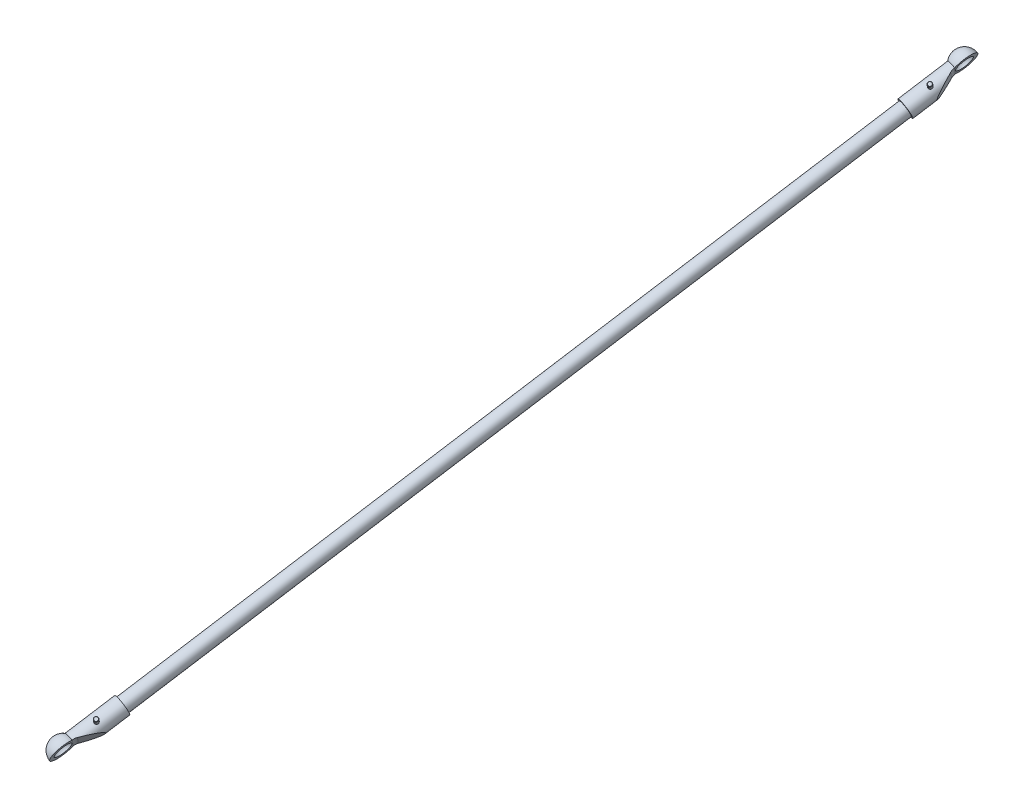
ISO-10303-21;
HEADER;
FILE_DESCRIPTION(('STEP AP214'),'2;1');
FILE_NAME('part.step','',(''),(''),'','','');
FILE_SCHEMA(('AUTOMOTIVE_DESIGN { 1 0 10303 214 1 1 1 1 }'));
ENDSEC;
DATA;
#1=APPLICATION_CONTEXT('core data for automotive mechanical design processes');
#2=APPLICATION_PROTOCOL_DEFINITION('international standard','automotive_design',2000,#1);
#3=PRODUCT_CONTEXT('',#1,'mechanical');
#4=PRODUCT('Part','Part','',(#3));
#5=PRODUCT_RELATED_PRODUCT_CATEGORY('part','',(#4));
#6=PRODUCT_DEFINITION_FORMATION('','',#4);
#7=PRODUCT_DEFINITION_CONTEXT('part definition',#1,'design');
#8=PRODUCT_DEFINITION('design','',#6,#7);
#9=PRODUCT_DEFINITION_SHAPE('','',#8);
#10=(LENGTH_UNIT() NAMED_UNIT(*) SI_UNIT(.MILLI.,.METRE.));
#11=(NAMED_UNIT(*) PLANE_ANGLE_UNIT() SI_UNIT($,.RADIAN.));
#12=(NAMED_UNIT(*) SI_UNIT($,.STERADIAN.) SOLID_ANGLE_UNIT());
#13=UNCERTAINTY_MEASURE_WITH_UNIT(LENGTH_MEASURE(1.E-05),#10,'distance_accuracy_value','');
#14=(GEOMETRIC_REPRESENTATION_CONTEXT(3) GLOBAL_UNCERTAINTY_ASSIGNED_CONTEXT((#13)) GLOBAL_UNIT_ASSIGNED_CONTEXT((#10,
#11,#12)) REPRESENTATION_CONTEXT('',''));
#15=CARTESIAN_POINT('',(0.,0.,0.));
#16=DIRECTION('',(0.,0.,1.));
#17=DIRECTION('',(1.,0.,0.));
#18=AXIS2_PLACEMENT_3D('',#15,#16,#17);
#19=CARTESIAN_POINT('',(-66.5672666528486,-13.4710930595909,-973.470594749536));
#20=DIRECTION('',(0.243875001140714,0.422187386320484,-0.873088079548963));
#21=DIRECTION('',(-0.436544042331025,-0.756116461061909,-0.487562505138062));
#22=AXIS2_PLACEMENT_3D('',#19,#20,#21);
#23=CYLINDRICAL_SURFACE('',#22,8.65);
#24=CARTESIAN_POINT('',(-79.3707042127361,-35.6359308414163,-927.633470573215));
#25=DIRECTION('',(0.243875001140714,0.422187386320484,-0.873088079548963));
#26=DIRECTION('',(-0.436544042331025,-0.756116461061909,-0.487562505138062));
#27=AXIS2_PLACEMENT_3D('',#24,#25,#26);
#28=CIRCLE('',#27,8.65);
#29=CARTESIAN_POINT('',(-83.1468101788995,-42.1763382296019,-931.850886242659));
#30=VERTEX_POINT('',#29);
#31=EDGE_CURVE('P0_E53',#30,#30,#28,.T.);
#32=ORIENTED_EDGE('',*,*,#31,.T.);
#33=EDGE_LOOP('',(#32));
#34=FACE_BOUND('',#33,.T.);
#35=DIRECTION('',(0.243875001140714,0.422187386320484,-0.873088079548963));
#36=VECTOR('',#35,1.);
#37=CARTESIAN_POINT('',(-70.343372619012,-20.0115004477764,-977.68801041898));
#38=LINE('',#37,#36);
#39=CARTESIAN_POINT('',(-72.4376135956511,-23.6369730059185,-970.190493970578));
#40=VERTEX_POINT('',#39);
#41=CARTESIAN_POINT('',(-72.3717544696229,-23.5229601216411,-970.426273847957));
#42=VERTEX_POINT('',#41);
#43=EDGE_CURVE('P0_E37',#40,#42,#38,.T.);
#44=ORIENTED_EDGE('',*,*,#43,.F.);
#45=CARTESIAN_POINT('',(-72.6861017253309,-25.6564240355279,-966.761144102993));
#46=CARTESIAN_POINT('',(-72.7043747173141,-25.5779330509969,-966.876927098913));
#47=CARTESIAN_POINT('',(-72.7196476328677,-25.4997304142377,-966.993353673411));
#48=CARTESIAN_POINT('',(-72.7442935848152,-25.3442520438576,-967.22744028067));
#49=CARTESIAN_POINT('',(-72.7536667541662,-25.2669762893869,-967.345100285574));
#50=CARTESIAN_POINT('',(-72.7730917032562,-25.0370163958307,-967.699924033564));
#51=CARTESIAN_POINT('',(-72.7744387973924,-24.8862439962847,-967.938866578895));
#52=CARTESIAN_POINT('',(-72.7548659493599,-24.5948501132937,-968.416482811695));
#53=CARTESIAN_POINT('',(-72.7343144313472,-24.4541018655955,-968.655095407673));
#54=CARTESIAN_POINT('',(-72.6722171491401,-24.1820303031464,-969.134789859197));
#55=CARTESIAN_POINT('',(-72.6306858069926,-24.0507005845941,-969.375869907166));
#56=CARTESIAN_POINT('',(-72.5586038599501,-23.8751848995356,-969.71272217079));
#57=CARTESIAN_POINT('',(-72.5366486889274,-23.8264150802868,-969.808025286144));
#58=CARTESIAN_POINT('',(-72.4895280297189,-23.7304513690291,-969.999045899332));
#59=CARTESIAN_POINT('',(-72.464352153529,-23.6832632291515,-970.094763724452));
#60=CARTESIAN_POINT('',(-72.4376135956511,-23.6369730059185,-970.190493970578));
#61=B_SPLINE_CURVE_WITH_KNOTS('',3,(#45,#46,#47,#48,#49,#50,#51,#52,#53,#54,#55,#56,#57,#58,#59,
#60),.UNSPECIFIED.,.F.,.F.,(4,2,2,2,2,2,2,4),(0.,0.423133087806681,0.846256639519751,
1.69274082725034,2.52520527690255,3.35709824718334,3.68490727157619,4.01380160023216),.UNSPECIFIED.);
#62=CARTESIAN_POINT('',(-72.6861017253309,-25.6564240355279,-966.761144102993));
#63=VERTEX_POINT('',#62);
#64=EDGE_CURVE('P0_E25',#63,#40,#61,.T.);
#65=ORIENTED_EDGE('',*,*,#64,.F.);
#66=CARTESIAN_POINT('',(-69.1576769270281,-17.9555155630788,-964.196760527297));
#67=DIRECTION('',(0.892445844922069,-0.295332745479864,-0.341055689482904));
#68=DIRECTION('',(-0.113884647721379,0.58400896119712,-0.80371874449638));
#69=AXIS2_PLACEMENT_3D('',#66,#67,#68);
#70=ELLIPSE('',#69,22.1379853543904,8.65);
#71=CARTESIAN_POINT('',(-65.1658502597658,-12.6309664114218,-958.362008418446));
#72=VERTEX_POINT('',#71);
#73=EDGE_CURVE('P0_E62',#72,#63,#70,.T.);
#74=ORIENTED_EDGE('',*,*,#73,.F.);
#75=CARTESIAN_POINT('',(-64.8854016633244,-10.5561582295475,-961.755662631689));
#76=CARTESIAN_POINT('',(-64.9198038793633,-10.6157146879746,-961.63250954567));
#77=CARTESIAN_POINT('',(-64.9516125956999,-10.6767480747575,-961.509366825998));
#78=CARTESIAN_POINT('',(-65.0100152347947,-10.801706563488,-961.263310287603));
#79=CARTESIAN_POINT('',(-65.0366090961444,-10.8656316994772,-961.140396471592));
#80=CARTESIAN_POINT('',(-65.108547350592,-11.0617086945621,-960.772203573503));
#81=CARTESIAN_POINT('',(-65.1460171195229,-11.1981079435305,-960.5275852597));
#82=CARTESIAN_POINT('',(-65.1995880235951,-11.4794440684664,-960.046525023254));
#83=CARTESIAN_POINT('',(-65.2160364409731,-11.6241997552243,-959.810014776676));
#84=CARTESIAN_POINT('',(-65.2291979072912,-11.9242315713149,-959.343376847598));
#85=CARTESIAN_POINT('',(-65.2259257251308,-12.0794997416238,-959.113244518361));
#86=CARTESIAN_POINT('',(-65.2082335240414,-12.3034781308216,-958.798642539105));
#87=CARTESIAN_POINT('',(-65.2017689958623,-12.3676342487357,-958.710398653834));
#88=CARTESIAN_POINT('',(-65.1859595293616,-12.4978827483923,-958.535153555313));
#89=CARTESIAN_POINT('',(-65.1766050318803,-12.5639808872438,-958.448157483915));
#90=CARTESIAN_POINT('',(-65.1658502597658,-12.6309664114219,-958.362008418446));
#91=B_SPLINE_CURVE_WITH_KNOTS('',3,(#75,#76,#77,#78,#79,#80,#81,#82,#83,#84,#85,#86,#87,#88,#89,
#90),.UNSPECIFIED.,.F.,.F.,(4,2,2,2,2,2,2,4),(0.,0.423104430557178,0.84621384317409,
1.69281689678866,2.5252448112881,3.35704939200978,3.68487734143038,4.0138014731745),.UNSPECIFIED.);
#92=CARTESIAN_POINT('',(-64.8854016633244,-10.5561582295475,-961.755662631689));
#93=VERTEX_POINT('',#92);
#94=EDGE_CURVE('P0_E11',#93,#72,#91,.T.);
#95=ORIENTED_EDGE('',*,*,#94,.F.);
#96=DIRECTION('',(0.243875001140714,0.422187386320484,-0.873088079548963));
#97=VECTOR('',#96,1.);
#98=CARTESIAN_POINT('',(-62.7911606866853,-6.93068567140542,-969.253179080091));
#99=LINE('',#98,#97);
#100=CARTESIAN_POINT('',(-64.8195425372962,-10.4421453452701,-961.991442509068));
#101=VERTEX_POINT('',#100);
#102=EDGE_CURVE('P0_E55',#101,#93,#99,.F.);
#103=ORIENTED_EDGE('',*,*,#102,.F.);
#104=CARTESIAN_POINT('',(-68.5956485034595,-16.9825527334556,-966.208858178512));
#105=DIRECTION('',(0.243875001140714,0.422187386320484,-0.873088079548963));
#106=DIRECTION('',(-0.436544042331025,-0.756116461061909,-0.487562505138062));
#107=AXIS2_PLACEMENT_3D('',#104,#105,#106);
#108=CIRCLE('',#107,8.65);
#109=EDGE_CURVE('P0_E49',#42,#101,#108,.T.);
#110=ORIENTED_EDGE('',*,*,#109,.F.);
#111=EDGE_LOOP('',(#44,#65,#74,#95,#103,#110));
#112=FACE_BOUND('',#111,.T.);
#113=ADVANCED_FACE('P0_F16',(#34,#112),#23,.T.);
#114=CARTESIAN_POINT('',(-66.5672666528486,-13.4710930595909,-973.470594749536));
#115=DIRECTION('',(0.243875001140714,0.422187386320484,-0.873088079548963));
#116=DIRECTION('',(-0.865999008616006,0.500045706054049,-9.45145584718802E-05));
#117=AXIS2_PLACEMENT_3D('',#114,#115,#116);
#118=SPHERICAL_SURFACE('',#117,12.);
#119=CARTESIAN_POINT('',(-66.5672666528486,-13.4710930595909,-973.470594749536));
#120=DIRECTION('',(0.865999008616006,-0.500045706054049,9.45145584718802E-05));
#121=DIRECTION('',(0.243875001140714,0.422187386320484,-0.873088079548963));
#122=AXIS2_PLACEMENT_3D('',#119,#120,#121);
#123=CIRCLE('',#122,12.);
#124=EDGE_CURVE('P0_E52',#42,#101,#123,.T.);
#125=ORIENTED_EDGE('',*,*,#124,.F.);
#126=ORIENTED_EDGE('',*,*,#109,.T.);
#127=EDGE_LOOP('',(#125,#126));
#128=FACE_BOUND('',#127,.T.);
#129=ADVANCED_FACE('P0_F50',(#128),#118,.T.);
#130=CARTESIAN_POINT('',(-79.3707042127361,-35.6359308414163,-927.633470573215));
#131=DIRECTION('',(0.243875001140714,0.422187386320484,-0.873088079548963));
#132=DIRECTION('',(-0.436544042331025,-0.756116461061909,-0.487562505138062));
#133=AXIS2_PLACEMENT_3D('',#130,#131,#132);
#134=PLANE('',#133);
#135=ORIENTED_EDGE('',*,*,#31,.F.);
#136=EDGE_LOOP('',(#135));
#137=FACE_BOUND('',#136,.T.);
#138=ADVANCED_FACE('P0_F18',(#137),#134,.F.);
#139=CARTESIAN_POINT('',(-15.5093941987425,54.9655954914829,-916.280260140939));
#140=DIRECTION('',(-0.436544042331025,-0.756116461061909,-0.487562505138062));
#141=DIRECTION('',(0.865999008616006,-0.500045706054049,9.45145584718802E-05));
#142=AXIS2_PLACEMENT_3D('',#139,#140,#141);
#143=CYLINDRICAL_SURFACE('',#142,10.);
#144=DIRECTION('',(-0.436544042331025,-0.756116461061909,-0.487562505138062));
#145=VECTOR('',#144,1.);
#146=CARTESIAN_POINT('',(-24.1693842849026,59.9660525520234,-916.281205286524));
#147=LINE('',#146,#145);
#148=EDGE_CURVE('P0_E59',#93,#40,#147,.T.);
#149=ORIENTED_EDGE('',*,*,#148,.F.);
#150=ORIENTED_EDGE('',*,*,#94,.T.);
#151=DIRECTION('',(-0.436544042331025,-0.756116461061909,-0.487562505138062));
#152=VECTOR('',#151,1.);
#153=CARTESIAN_POINT('',(-24.4338526479633,57.9189229462815,-912.86970324611));
#154=LINE('',#153,#152);
#155=EDGE_CURVE('P0_E154',#72,#63,#154,.T.);
#156=ORIENTED_EDGE('',*,*,#155,.T.);
#157=ORIENTED_EDGE('',*,*,#64,.T.);
#158=EDGE_LOOP('',(#149,#150,#156,#157));
#159=FACE_BOUND('',#158,.T.);
#160=ADVANCED_FACE('P0_F80',(#159),#143,.F.);
#161=CARTESIAN_POINT('',(-24.4338526479633,57.9189229462815,-912.86970324611));
#162=DIRECTION('',(0.892445844922069,-0.295332745479864,-0.341055689482904));
#163=DIRECTION('',(-0.113884647721379,0.58400896119712,-0.803718744496381));
#164=AXIS2_PLACEMENT_3D('',#161,#162,#163);
#165=PLANE('',#164);
#166=ORIENTED_EDGE('',*,*,#155,.F.);
#167=ORIENTED_EDGE('',*,*,#73,.T.);
#168=EDGE_LOOP('',(#166,#167));
#169=FACE_BOUND('',#168,.T.);
#170=ADVANCED_FACE('P0_F85',(#169),#165,.T.);
#171=CARTESIAN_POINT('',(-17.3493035482215,71.772724196292,-940.697529899156));
#172=DIRECTION('',(0.865999008616006,-0.500045706054049,9.45145584718802E-05));
#173=DIRECTION('',(0.243875001140714,0.422187386320484,-0.873088079548963));
#174=AXIS2_PLACEMENT_3D('',#171,#172,#173);
#175=PLANE('',#174);
#176=CARTESIAN_POINT('',(-66.5672666528486,-13.4710930595909,-973.470594749536));
#177=DIRECTION('',(0.865999008616006,-0.500045706054049,9.45145584718802E-05));
#178=DIRECTION('',(0.243875001140714,0.422187386320484,-0.873088079548963));
#179=AXIS2_PLACEMENT_3D('',#176,#177,#178);
#180=CIRCLE('',#179,7.97226838534743);
#181=CARTESIAN_POINT('',(-64.6230296912779,-10.1053019069357,-980.431087243748));
#182=VERTEX_POINT('',#181);
#183=EDGE_CURVE('P0_E20',#182,#182,#180,.T.);
#184=ORIENTED_EDGE('',*,*,#183,.F.);
#185=EDGE_LOOP('',(#184));
#186=FACE_BOUND('',#185,.T.);
#187=ORIENTED_EDGE('',*,*,#148,.T.);
#188=ORIENTED_EDGE('',*,*,#43,.T.);
#189=ORIENTED_EDGE('',*,*,#124,.T.);
#190=ORIENTED_EDGE('',*,*,#102,.T.);
#191=EDGE_LOOP('',(#187,#188,#189,#190));
#192=FACE_BOUND('',#191,.T.);
#193=ADVANCED_FACE('P0_F61',(#186,#192),#175,.T.);
#194=CARTESIAN_POINT('',(-66.5672666528486,-13.4710930595909,-973.470594749536));
#195=DIRECTION('',(-0.865999008616006,0.500045706054049,-9.45145584719848E-05));
#196=DIRECTION('',(-0.243875001140714,-0.422187386320483,0.873088079548963));
#197=AXIS2_PLACEMENT_3D('',#194,#195,#196);
#198=SPHERICAL_SURFACE('',#197,7.97226838534743);
#199=ORIENTED_EDGE('',*,*,#183,.T.);
#200=EDGE_LOOP('',(#199));
#201=FACE_BOUND('',#200,.T.);
#202=ADVANCED_FACE('P0_F90',(#201),#198,.F.);
#203=CLOSED_SHELL('',(#113,#129,#138,#160,#170,#193,#202));
#204=MANIFOLD_SOLID_BREP('P0_B1',#203);
#205=CARTESIAN_POINT('',(-66.4814626562708,-13.3163515001442,-940.971089621079));
#206=DIRECTION('',(0.436544042331025,0.75611646106191,0.487562505138062));
#207=DIRECTION('',(0.865999008616006,-0.500045706054049,9.45145584719375E-05));
#208=AXIS2_PLACEMENT_3D('',#205,#206,#207);
#209=PLANE('',#208);
#210=CARTESIAN_POINT('',(-66.8988120097736,-14.0388512722149,-939.476952280858));
#211=DIRECTION('',(-0.436544042331025,-0.75611646106191,-0.487562505138062));
#212=DIRECTION('',(-0.865999008616006,0.500045706054049,-9.45145584719375E-05));
#213=AXIS2_PLACEMENT_3D('',#210,#211,#212);
#214=CIRCLE('',#213,1.71132486540518);
#215=CARTESIAN_POINT('',(-68.3808176466344,-13.1831106216055,-939.477114025972));
#216=VERTEX_POINT('',#215);
#217=EDGE_CURVE('P1_E28',#216,#216,#214,.T.);
#218=ORIENTED_EDGE('',*,*,#217,.F.);
#219=EDGE_LOOP('',(#218));
#220=FACE_BOUND('',#219,.T.);
#221=ADVANCED_FACE('P1_F14',(#220),#209,.T.);
#222=CARTESIAN_POINT('',(-80.4508720108636,-37.5120782541253,-956.573089785497));
#223=DIRECTION('',(0.436544042331025,0.75611646106191,0.487562505138062));
#224=DIRECTION('',(0.865999008616006,-0.500045706054049,9.45145584719375E-05));
#225=AXIS2_PLACEMENT_3D('',#222,#223,#224);
#226=PLANE('',#225);
#227=CARTESIAN_POINT('',(-80.8682213643664,-38.234578026196,-955.078952445276));
#228=DIRECTION('',(-0.436544042331025,-0.75611646106191,-0.487562505138062));
#229=DIRECTION('',(-0.865999008616006,0.500045706054049,-9.45145584719375E-05));
#230=AXIS2_PLACEMENT_3D('',#227,#228,#229);
#231=CIRCLE('',#230,1.71132486540518);
#232=CARTESIAN_POINT('',(-82.3502270012272,-37.3788373755866,-955.07911419039));
#233=VERTEX_POINT('',#232);
#234=EDGE_CURVE('P1_E10',#233,#233,#231,.T.);
#235=ORIENTED_EDGE('',*,*,#234,.T.);
#236=EDGE_LOOP('',(#235));
#237=FACE_BOUND('',#236,.T.);
#238=ADVANCED_FACE('P1_F38',(#237),#226,.F.);
#239=CARTESIAN_POINT('',(-80.6499493432009,-37.8565197956651,-954.835171192707));
#240=DIRECTION('',(0.436544042331025,0.75611646106191,0.487562505138062));
#241=DIRECTION('',(0.865999008616006,-0.500045706054049,9.45145584719375E-05));
#242=AXIS2_PLACEMENT_3D('',#239,#240,#241);
#243=CONICAL_SURFACE('',#242,2.,0.523598775598299);
#244=ORIENTED_EDGE('',*,*,#234,.F.);
#245=EDGE_LOOP('',(#244));
#246=FACE_BOUND('',#245,.T.);
#247=CARTESIAN_POINT('',(-80.6499493432009,-37.8565197956651,-954.835171192707));
#248=DIRECTION('',(-0.436544042331025,-0.75611646106191,-0.487562505138062));
#249=DIRECTION('',(-0.865999008616006,0.500045706054049,-9.45145584719375E-05));
#250=AXIS2_PLACEMENT_3D('',#247,#248,#249);
#251=CIRCLE('',#250,2.);
#252=CARTESIAN_POINT('',(-82.3819473604329,-36.856428383557,-954.835360221824));
#253=VERTEX_POINT('',#252);
#254=EDGE_CURVE('P1_E20',#253,#253,#251,.T.);
#255=ORIENTED_EDGE('',*,*,#254,.T.);
#256=EDGE_LOOP('',(#255));
#257=FACE_BOUND('',#256,.T.);
#258=ADVANCED_FACE('P1_F43',(#246,#257),#243,.T.);
#259=CARTESIAN_POINT('',(-73.88351668707,-26.1367146492054,-947.277952363067));
#260=DIRECTION('',(-0.436544042331025,-0.75611646106191,-0.487562505138062));
#261=DIRECTION('',(-0.865999008616006,0.500045706054049,-9.45145584719375E-05));
#262=AXIS2_PLACEMENT_3D('',#259,#260,#261);
#263=CYLINDRICAL_SURFACE('',#262,2.);
#264=CARTESIAN_POINT('',(-67.1170840309392,-14.4169095027458,-939.720733533427));
#265=DIRECTION('',(-0.436544042331025,-0.75611646106191,-0.487562505138062));
#266=DIRECTION('',(-0.865999008616006,0.500045706054049,-9.45145584719375E-05));
#267=AXIS2_PLACEMENT_3D('',#264,#265,#266);
#268=CIRCLE('',#267,2.);
#269=CARTESIAN_POINT('',(-68.8490820481712,-13.4168180906377,-939.720922562544));
#270=VERTEX_POINT('',#269);
#271=EDGE_CURVE('P1_E24',#270,#270,#268,.T.);
#272=ORIENTED_EDGE('',*,*,#271,.T.);
#273=EDGE_LOOP('',(#272));
#274=FACE_BOUND('',#273,.T.);
#275=ORIENTED_EDGE('',*,*,#254,.F.);
#276=EDGE_LOOP('',(#275));
#277=FACE_BOUND('',#276,.T.);
#278=ADVANCED_FACE('P1_F47',(#274,#277),#263,.T.);
#279=CARTESIAN_POINT('',(-67.1170840309392,-14.4169095027458,-939.720733533427));
#280=DIRECTION('',(-0.436544042331025,-0.75611646106191,-0.487562505138062));
#281=DIRECTION('',(-0.865999008616006,0.500045706054049,-9.45145584719375E-05));
#282=AXIS2_PLACEMENT_3D('',#279,#280,#281);
#283=CONICAL_SURFACE('',#282,2.,0.523598775598299);
#284=ORIENTED_EDGE('',*,*,#217,.T.);
#285=EDGE_LOOP('',(#284));
#286=FACE_BOUND('',#285,.T.);
#287=ORIENTED_EDGE('',*,*,#271,.F.);
#288=EDGE_LOOP('',(#287));
#289=FACE_BOUND('',#288,.T.);
#290=ADVANCED_FACE('P1_F34',(#286,#289),#283,.T.);
#291=CLOSED_SHELL('',(#221,#238,#258,#278,#290));
#292=MANIFOLD_SOLID_BREP('P1_B1',#291);
#293=CARTESIAN_POINT('',(-261.667267565419,-351.221002115978,-275.000131110365));
#294=DIRECTION('',(-0.243875001140714,-0.422187386320483,0.873088079548963));
#295=DIRECTION('',(0.436544042331025,0.756116461061909,0.487562505138062));
#296=AXIS2_PLACEMENT_3D('',#293,#294,#295);
#297=CYLINDRICAL_SURFACE('',#296,8.65);
#298=CARTESIAN_POINT('',(-248.863830005532,-329.056164334152,-320.837255286686));
#299=DIRECTION('',(-0.243875001140714,-0.422187386320483,0.873088079548963));
#300=DIRECTION('',(0.436544042331025,0.756116461061909,0.487562505138062));
#301=AXIS2_PLACEMENT_3D('',#298,#299,#300);
#302=CIRCLE('',#301,8.65);
#303=CARTESIAN_POINT('',(-245.087724039369,-322.515756945967,-316.619839617242));
#304=VERTEX_POINT('',#303);
#305=EDGE_CURVE('P2_E53',#304,#304,#302,.T.);
#306=ORIENTED_EDGE('',*,*,#305,.T.);
#307=EDGE_LOOP('',(#306));
#308=FACE_BOUND('',#307,.T.);
#309=DIRECTION('',(-0.243875001140714,-0.422187386320483,0.873088079548963));
#310=VECTOR('',#309,1.);
#311=CARTESIAN_POINT('',(-257.891161599256,-344.680594727792,-270.782715440922));
#312=LINE('',#311,#310);
#313=CARTESIAN_POINT('',(-255.796920622617,-341.055122169651,-278.280231889323));
#314=VERTEX_POINT('',#313);
#315=CARTESIAN_POINT('',(-255.862779748645,-341.169135053928,-278.044452011944));
#316=VERTEX_POINT('',#315);
#317=EDGE_CURVE('P2_E37',#314,#316,#312,.T.);
#318=ORIENTED_EDGE('',*,*,#317,.F.);
#319=CARTESIAN_POINT('',(-254.171578130938,-339.830695273706,-281.709431487934));
#320=CARTESIAN_POINT('',(-254.248711238073,-339.854096806955,-281.593658904572));
#321=CARTESIAN_POINT('',(-254.324094954944,-339.879952432553,-281.477242224279));
#322=CARTESIAN_POINT('',(-254.471110419899,-339.936309956878,-281.243174352034));
#323=CARTESIAN_POINT('',(-254.542742252502,-339.966811750879,-281.125523187963));
#324=CARTESIAN_POINT('',(-254.751674279355,-340.064913612115,-280.770724362701));
#325=CARTESIAN_POINT('',(-254.882967502013,-340.139096754395,-280.531796293647));
#326=CARTESIAN_POINT('',(-255.125630934277,-340.301673528364,-280.054204408806));
#327=CARTESIAN_POINT('',(-255.237295100027,-340.389811452245,-279.815601756801));
#328=CARTESIAN_POINT('',(-255.44196590355,-340.579558120067,-279.335922865658));
#329=CARTESIAN_POINT('',(-255.534985296925,-340.681157574874,-279.09484843706));
#330=CARTESIAN_POINT('',(-255.651016360113,-340.831296132945,-278.758000970014));
#331=CARTESIAN_POINT('',(-255.682294858956,-340.87468247023,-278.662698872201));
#332=CARTESIAN_POINT('',(-255.741882183246,-340.963447671697,-278.471679619617));
#333=CARTESIAN_POINT('',(-255.770180833898,-341.00883265713,-278.375962135315));
#334=CARTESIAN_POINT('',(-255.796920622617,-341.055122169651,-278.280231889323));
#335=B_SPLINE_CURVE_WITH_KNOTS('',3,(#319,#320,#321,#322,#323,#324,#325,#326,#327,#328,#329,
#330,#331,#332,#333,#334),.UNSPECIFIED.,.F.,.F.,(4,2,2,2,2,2,2,4),(0.,0.423133087806677,
0.846256639519604,1.6927408272502,2.5252052769023,3.35709824718274,3.68490727157535,
4.01380160023115),.UNSPECIFIED.);
#336=CARTESIAN_POINT('',(-254.171578130938,-339.830695273706,-281.709431487934));
#337=VERTEX_POINT('',#336);
#338=EDGE_CURVE('P2_E25',#337,#314,#335,.T.);
#339=ORIENTED_EDGE('',*,*,#338,.F.);
#340=CARTESIAN_POINT('',(-259.07685729124,-346.73657961249,-284.273965332604));
#341=DIRECTION('',(0.701866736110001,-0.625256253261744,0.341229691702495));
#342=DIRECTION('',(-0.562860892092872,-0.193242115151691,0.8036448849362));
#343=AXIS2_PLACEMENT_3D('',#340,#341,#342);
#344=ELLIPSE('',#343,22.1379853543904,8.65);
#345=CARTESIAN_POINT('',(-261.691829596503,-352.856152897812,-290.108567172481));
#346=VERTEX_POINT('',#345);
#347=EDGE_CURVE('P2_E62',#346,#337,#344,.T.);
#348=ORIENTED_EDGE('',*,*,#347,.F.);
#349=CARTESIAN_POINT('',(-263.349132554944,-354.135936946021,-286.715063228212));
#350=CARTESIAN_POINT('',(-263.314729808775,-354.076380793702,-286.838216314173));
#351=CARTESIAN_POINT('',(-263.277751416177,-354.018332484721,-286.96135846963));
#352=CARTESIAN_POINT('',(-263.19868329709,-353.905306670775,-287.207412752608));
#353=CARTESIAN_POINT('',(-263.156593510421,-353.850329201977,-287.330324877404));
#354=CARTESIAN_POINT('',(-263.022677781853,-353.690039279969,-287.698511011313));
#355=CARTESIAN_POINT('',(-262.923236784394,-353.589423497744,-287.943122561617));
#356=CARTESIAN_POINT('',(-262.70627951249,-353.402430034692,-288.424164966183));
#357=CARTESIAN_POINT('',(-262.589093760245,-353.3158421648,-288.660664218355));
#358=CARTESIAN_POINT('',(-262.335745895177,-353.154498933977,-289.127275933649));
#359=CARTESIAN_POINT('',(-262.199598057829,-353.079734761247,-289.357393046677));
#360=CARTESIAN_POINT('',(-261.996719281165,-352.983118608274,-289.671970952963));
#361=CARTESIAN_POINT('',(-261.937908949428,-352.95665354207,-289.760207714178));
#362=CARTESIAN_POINT('',(-261.817171591838,-352.905249997641,-289.935437910069));
#363=CARTESIAN_POINT('',(-261.755234802016,-352.880316919881,-290.022426200783));
#364=CARTESIAN_POINT('',(-261.691829596503,-352.856152897812,-290.108567172481));
#365=B_SPLINE_CURVE_WITH_KNOTS('',3,(#349,#350,#351,#352,#353,#354,#355,#356,#357,#358,#359,
#360,#361,#362,#363,#364),.UNSPECIFIED.,.F.,.F.,(4,2,2,2,2,2,2,4),(0.,0.423104430557068,
0.846213843173972,1.69281689678892,2.52524481128839,3.35704939201012,3.68487734143041,
4.01380147317444),.UNSPECIFIED.);
#366=CARTESIAN_POINT('',(-263.349132554944,-354.135936946021,-286.715063228212));
#367=VERTEX_POINT('',#366);
#368=EDGE_CURVE('P2_E11',#367,#346,#365,.T.);
#369=ORIENTED_EDGE('',*,*,#368,.F.);
#370=DIRECTION('',(-0.243875001140714,-0.422187386320483,0.873088079548963));
#371=VECTOR('',#370,1.);
#372=CARTESIAN_POINT('',(-265.443373531583,-357.761409504163,-279.217546779809));
#373=LINE('',#372,#371);
#374=CARTESIAN_POINT('',(-263.414991680972,-354.249949830299,-286.479283350833));
#375=VERTEX_POINT('',#374);
#376=EDGE_CURVE('P2_E55',#375,#367,#373,.F.);
#377=ORIENTED_EDGE('',*,*,#376,.F.);
#378=CARTESIAN_POINT('',(-259.638885714809,-347.709542442114,-282.261867681388));
#379=DIRECTION('',(-0.243875001140714,-0.422187386320483,0.873088079548963));
#380=DIRECTION('',(0.436544042331025,0.756116461061909,0.487562505138062));
#381=AXIS2_PLACEMENT_3D('',#378,#379,#380);
#382=CIRCLE('',#381,8.65);
#383=EDGE_CURVE('P2_E49',#316,#375,#382,.T.);
#384=ORIENTED_EDGE('',*,*,#383,.F.);
#385=EDGE_LOOP('',(#318,#339,#348,#369,#377,#384));
#386=FACE_BOUND('',#385,.T.);
#387=ADVANCED_FACE('P2_F16',(#308,#386),#297,.T.);
#388=CARTESIAN_POINT('',(-261.667267565419,-351.221002115978,-275.000131110365));
#389=DIRECTION('',(-0.243875001140714,-0.422187386320483,0.873088079548963));
#390=DIRECTION('',(-0.865999008616006,0.500045706054049,-9.45145584719927E-05));
#391=AXIS2_PLACEMENT_3D('',#388,#389,#390);
#392=SPHERICAL_SURFACE('',#391,12.);
#393=CARTESIAN_POINT('',(-261.667267565419,-351.221002115978,-275.000131110365));
#394=DIRECTION('',(0.865999008616006,-0.500045706054049,9.45145584719927E-05));
#395=DIRECTION('',(-0.243875001140714,-0.422187386320483,0.873088079548963));
#396=AXIS2_PLACEMENT_3D('',#393,#394,#395);
#397=CIRCLE('',#396,12.);
#398=EDGE_CURVE('P2_E52',#316,#375,#397,.T.);
#399=ORIENTED_EDGE('',*,*,#398,.F.);
#400=ORIENTED_EDGE('',*,*,#383,.T.);
#401=EDGE_LOOP('',(#399,#400));
#402=FACE_BOUND('',#401,.T.);
#403=ADVANCED_FACE('P2_F50',(#402),#392,.T.);
#404=CARTESIAN_POINT('',(-248.863830005532,-329.056164334152,-320.837255286686));
#405=DIRECTION('',(-0.243875001140714,-0.422187386320483,0.873088079548963));
#406=DIRECTION('',(0.436544042331025,0.756116461061909,0.487562505138062));
#407=AXIS2_PLACEMENT_3D('',#404,#405,#406);
#408=PLANE('',#407);
#409=ORIENTED_EDGE('',*,*,#305,.F.);
#410=EDGE_LOOP('',(#409));
#411=FACE_BOUND('',#410,.T.);
#412=ADVANCED_FACE('P2_F18',(#411),#408,.F.);
#413=CARTESIAN_POINT('',(-295.405159847205,-429.658604788133,-332.188575427793));
#414=DIRECTION('',(0.436544042331025,0.756116461061909,0.487562505138062));
#415=DIRECTION('',(0.865999008616006,-0.500045706054049,9.45145584719927E-05));
#416=AXIS2_PLACEMENT_3D('',#413,#414,#415);
#417=CYLINDRICAL_SURFACE('',#416,10.);
#418=DIRECTION('',(0.436544042331025,0.756116461061909,0.487562505138062));
#419=VECTOR('',#418,1.);
#420=CARTESIAN_POINT('',(-304.065149933366,-424.658147727592,-332.189520573377));
#421=LINE('',#420,#419);
#422=EDGE_CURVE('P2_E59',#367,#314,#421,.T.);
#423=ORIENTED_EDGE('',*,*,#422,.F.);
#424=ORIENTED_EDGE('',*,*,#368,.T.);
#425=DIRECTION('',(0.436544042331025,0.756116461061909,0.487562505138062));
#426=VECTOR('',#425,1.);
#427=CARTESIAN_POINT('',(-302.423827208305,-423.406042255516,-335.600872344818));
#428=LINE('',#427,#426);
#429=EDGE_CURVE('P2_E154',#346,#337,#428,.T.);
#430=ORIENTED_EDGE('',*,*,#429,.T.);
#431=ORIENTED_EDGE('',*,*,#338,.T.);
#432=EDGE_LOOP('',(#423,#424,#430,#431));
#433=FACE_BOUND('',#432,.T.);
#434=ADVANCED_FACE('P2_F80',(#433),#417,.F.);
#435=CARTESIAN_POINT('',(-302.423827208305,-423.406042255516,-335.600872344818));
#436=DIRECTION('',(0.701866736110001,-0.625256253261744,0.341229691702495));
#437=DIRECTION('',(-0.562860892092872,-0.193242115151691,0.8036448849362));
#438=AXIS2_PLACEMENT_3D('',#435,#436,#437);
#439=PLANE('',#438);
#440=ORIENTED_EDGE('',*,*,#429,.F.);
#441=ORIENTED_EDGE('',*,*,#347,.T.);
#442=EDGE_LOOP('',(#440,#441));
#443=FACE_BOUND('',#442,.T.);
#444=ADVANCED_FACE('P2_F85',(#443),#439,.T.);
#445=CARTESIAN_POINT('',(-310.885230670047,-436.464819371861,-307.773195960745));
#446=DIRECTION('',(0.865999008616006,-0.500045706054049,9.45145584719927E-05));
#447=DIRECTION('',(-0.243875001140714,-0.422187386320483,0.873088079548963));
#448=AXIS2_PLACEMENT_3D('',#445,#446,#447);
#449=PLANE('',#448);
#450=CARTESIAN_POINT('',(-261.667267565419,-351.221002115978,-275.000131110365));
#451=DIRECTION('',(0.865999008616006,-0.500045706054049,9.45145584719927E-05));
#452=DIRECTION('',(-0.243875001140714,-0.422187386320483,0.873088079548963));
#453=AXIS2_PLACEMENT_3D('',#450,#451,#452);
#454=CIRCLE('',#453,7.97226838534743);
#455=CARTESIAN_POINT('',(-263.61150452699,-354.586793268633,-268.039638616154));
#456=VERTEX_POINT('',#455);
#457=EDGE_CURVE('P2_E20',#456,#456,#454,.T.);
#458=ORIENTED_EDGE('',*,*,#457,.F.);
#459=EDGE_LOOP('',(#458));
#460=FACE_BOUND('',#459,.T.);
#461=ORIENTED_EDGE('',*,*,#422,.T.);
#462=ORIENTED_EDGE('',*,*,#317,.T.);
#463=ORIENTED_EDGE('',*,*,#398,.T.);
#464=ORIENTED_EDGE('',*,*,#376,.T.);
#465=EDGE_LOOP('',(#461,#462,#463,#464));
#466=FACE_BOUND('',#465,.T.);
#467=ADVANCED_FACE('P2_F61',(#460,#466),#449,.T.);
#468=CARTESIAN_POINT('',(-261.667267565419,-351.221002115978,-275.000131110365));
#469=DIRECTION('',(-0.865999008616006,0.500045706054049,-9.45145584718882E-05));
#470=DIRECTION('',(0.243875001140714,0.422187386320483,-0.873088079548963));
#471=AXIS2_PLACEMENT_3D('',#468,#469,#470);
#472=SPHERICAL_SURFACE('',#471,7.97226838534743);
#473=ORIENTED_EDGE('',*,*,#457,.T.);
#474=EDGE_LOOP('',(#473));
#475=FACE_BOUND('',#474,.T.);
#476=ADVANCED_FACE('P2_F90',(#475),#472,.F.);
#477=CLOSED_SHELL('',(#387,#403,#412,#434,#444,#467,#476));
#478=MANIFOLD_SOLID_BREP('P2_B1',#477);
#479=CARTESIAN_POINT('',(-261.753071561998,-351.375743675425,-307.499636238823));
#480=DIRECTION('',(-0.436544042331025,-0.756116461061909,-0.487562505138062));
#481=DIRECTION('',(0.865999008616006,-0.500045706054049,9.45145584719355E-05));
#482=AXIS2_PLACEMENT_3D('',#479,#480,#481);
#483=PLANE('',#482);
#484=CARTESIAN_POINT('',(-261.335722208494,-350.653243903354,-308.993773579044));
#485=DIRECTION('',(0.436544042331025,0.756116461061909,0.487562505138062));
#486=DIRECTION('',(-0.865999008616006,0.500045706054049,-9.45145584719355E-05));
#487=AXIS2_PLACEMENT_3D('',#484,#485,#486);
#488=CIRCLE('',#487,1.71132486540518);
#489=CARTESIAN_POINT('',(-262.817727845355,-349.797503252745,-308.993935324158));
#490=VERTEX_POINT('',#489);
#491=EDGE_CURVE('P3_E28',#490,#490,#488,.T.);
#492=ORIENTED_EDGE('',*,*,#491,.F.);
#493=EDGE_LOOP('',(#492));
#494=FACE_BOUND('',#493,.T.);
#495=ADVANCED_FACE('P3_F14',(#494),#483,.T.);
#496=CARTESIAN_POINT('',(-247.783662207404,-327.180016921443,-291.897636074404));
#497=DIRECTION('',(-0.436544042331025,-0.756116461061909,-0.487562505138062));
#498=DIRECTION('',(0.865999008616006,-0.500045706054049,9.45145584719355E-05));
#499=AXIS2_PLACEMENT_3D('',#496,#497,#498);
#500=PLANE('',#499);
#501=CARTESIAN_POINT('',(-247.366312853902,-326.457517149373,-293.391773414626));
#502=DIRECTION('',(0.436544042331025,0.756116461061909,0.487562505138062));
#503=DIRECTION('',(-0.865999008616006,0.500045706054049,-9.45145584719355E-05));
#504=AXIS2_PLACEMENT_3D('',#501,#502,#503);
#505=CIRCLE('',#504,1.71132486540518);
#506=CARTESIAN_POINT('',(-245.884307217041,-327.313257799982,-293.391611669511));
#507=VERTEX_POINT('',#506);
#508=EDGE_CURVE('P3_E10',#507,#507,#505,.T.);
#509=ORIENTED_EDGE('',*,*,#508,.T.);
#510=EDGE_LOOP('',(#509));
#511=FACE_BOUND('',#510,.T.);
#512=ADVANCED_FACE('P3_F38',(#511),#500,.F.);
#513=CARTESIAN_POINT('',(-247.584584875067,-326.835575379904,-293.635554667195));
#514=DIRECTION('',(-0.436544042331025,-0.756116461061909,-0.487562505138062));
#515=DIRECTION('',(0.865999008616006,-0.500045706054049,9.45145584719355E-05));
#516=AXIS2_PLACEMENT_3D('',#513,#514,#515);
#517=CONICAL_SURFACE('',#516,2.,0.523598775598299);
#518=CARTESIAN_POINT('',(-247.584584875067,-326.835575379904,-293.635554667195));
#519=DIRECTION('',(0.436544042331025,0.756116461061909,0.487562505138062));
#520=DIRECTION('',(-0.865999008616006,0.500045706054049,-9.45145584719355E-05));
#521=AXIS2_PLACEMENT_3D('',#518,#519,#520);
#522=CIRCLE('',#521,2.);
#523=CARTESIAN_POINT('',(-245.852586857835,-327.835666792012,-293.635365638078));
#524=VERTEX_POINT('',#523);
#525=EDGE_CURVE('P3_E20',#524,#524,#522,.T.);
#526=CARTESIAN_POINT('',(-245.884307217041,-327.313257799982,-293.391611669511));
#527=CARTESIAN_POINT('',(-245.883976796633,-327.318699560316,-293.394150773351));
#528=CARTESIAN_POINT('',(-245.883646376224,-327.32414132065,-293.39668987719));
#529=CARTESIAN_POINT('',(-245.882985535408,-327.335024841317,-293.401768084868));
#530=CARTESIAN_POINT('',(-245.882655114999,-327.340466601651,-293.404307188708));
#531=CARTESIAN_POINT('',(-245.881994274182,-327.351350122318,-293.409385396386));
#532=CARTESIAN_POINT('',(-245.881663853774,-327.356791882652,-293.411924500225));
#533=CARTESIAN_POINT('',(-245.881003012957,-327.367675403319,-293.417002707904));
#534=CARTESIAN_POINT('',(-245.880672592549,-327.373117163652,-293.419541811743));
#535=CARTESIAN_POINT('',(-245.880011751732,-327.38400068432,-293.424620019421));
#536=CARTESIAN_POINT('',(-245.879681331324,-327.389442444653,-293.427159123261));
#537=CARTESIAN_POINT('',(-245.879020490507,-327.400325965321,-293.432237330939));
#538=CARTESIAN_POINT('',(-245.878690070098,-327.405767725654,-293.434776434778));
#539=CARTESIAN_POINT('',(-245.878029229282,-327.416651246322,-293.439854642457));
#540=CARTESIAN_POINT('',(-245.877698808873,-327.422093006655,-293.442393746296));
#541=CARTESIAN_POINT('',(-245.877037968057,-327.432976527323,-293.447471953975));
#542=CARTESIAN_POINT('',(-245.876707547648,-327.438418287656,-293.450011057814));
#543=CARTESIAN_POINT('',(-245.876046706831,-327.449301808323,-293.455089265492));
#544=CARTESIAN_POINT('',(-245.875716286423,-327.454743568657,-293.457628369331));
#545=CARTESIAN_POINT('',(-245.875055445606,-327.465627089324,-293.46270657701));
#546=CARTESIAN_POINT('',(-245.874725025198,-327.471068849658,-293.465245680849));
#547=CARTESIAN_POINT('',(-245.874064184381,-327.481952370325,-293.470323888528));
#548=CARTESIAN_POINT('',(-245.873733763973,-327.487394130659,-293.472862992367));
#549=CARTESIAN_POINT('',(-245.873072923156,-327.498277651326,-293.477941200045));
#550=CARTESIAN_POINT('',(-245.872742502747,-327.50371941166,-293.480480303885));
#551=CARTESIAN_POINT('',(-245.872081661931,-327.514602932327,-293.485558511563));
#552=CARTESIAN_POINT('',(-245.871751241522,-327.520044692661,-293.488097615402));
#553=CARTESIAN_POINT('',(-245.871090400705,-327.530928213328,-293.493175823081));
#554=CARTESIAN_POINT('',(-245.870759980297,-327.536369973662,-293.49571492692));
#555=CARTESIAN_POINT('',(-245.87009913948,-327.547253494329,-293.500793134598));
#556=CARTESIAN_POINT('',(-245.869768719072,-327.552695254663,-293.503332238438));
#557=CARTESIAN_POINT('',(-245.869107878255,-327.56357877533,-293.508410446116));
#558=CARTESIAN_POINT('',(-245.868777457847,-327.569020535664,-293.510949549955));
#559=CARTESIAN_POINT('',(-245.86811661703,-327.579904056331,-293.516027757634));
#560=CARTESIAN_POINT('',(-245.867786196622,-327.585345816665,-293.518566861473));
#561=CARTESIAN_POINT('',(-245.867125355805,-327.596229337332,-293.523645069151));
#562=CARTESIAN_POINT('',(-245.866794935396,-327.601671097665,-293.526184172991));
#563=CARTESIAN_POINT('',(-245.86613409458,-327.612554618333,-293.531262380669));
#564=CARTESIAN_POINT('',(-245.865803674171,-327.617996378666,-293.533801484508));
#565=CARTESIAN_POINT('',(-245.865142833354,-327.628879899334,-293.538879692187));
#566=CARTESIAN_POINT('',(-245.864812412946,-327.634321659667,-293.541418796026));
#567=CARTESIAN_POINT('',(-245.864151572129,-327.645205180335,-293.546497003704));
#568=CARTESIAN_POINT('',(-245.863821151721,-327.650646940668,-293.549036107544));
#569=CARTESIAN_POINT('',(-245.863160310904,-327.661530461336,-293.554114315222));
#570=CARTESIAN_POINT('',(-245.862829890496,-327.666972221669,-293.556653419061));
#571=CARTESIAN_POINT('',(-245.862169049679,-327.677855742336,-293.56173162674));
#572=CARTESIAN_POINT('',(-245.86183862927,-327.68329750267,-293.564270730579));
#573=CARTESIAN_POINT('',(-245.861177788454,-327.694181023337,-293.569348938258));
#574=CARTESIAN_POINT('',(-245.860847368045,-327.699622783671,-293.571888042097));
#575=CARTESIAN_POINT('',(-245.860186527229,-327.710506304338,-293.576966249775));
#576=CARTESIAN_POINT('',(-245.85985610682,-327.715948064672,-293.579505353615));
#577=CARTESIAN_POINT('',(-245.859195266003,-327.726831585339,-293.584583561293));
#578=CARTESIAN_POINT('',(-245.858864845595,-327.732273345673,-293.587122665132));
#579=CARTESIAN_POINT('',(-245.858204004778,-327.74315686634,-293.592200872811));
#580=CARTESIAN_POINT('',(-245.85787358437,-327.748598626674,-293.59473997665));
#581=CARTESIAN_POINT('',(-245.857212743553,-327.759482147341,-293.599818184328));
#582=CARTESIAN_POINT('',(-245.856882323145,-327.764923907675,-293.602357288168));
#583=CARTESIAN_POINT('',(-245.856221482328,-327.775807428342,-293.607435495846));
#584=CARTESIAN_POINT('',(-245.855891061919,-327.781249188676,-293.609974599685));
#585=CARTESIAN_POINT('',(-245.855230221103,-327.792132709343,-293.615052807364));
#586=CARTESIAN_POINT('',(-245.854899800694,-327.797574469677,-293.617591911203));
#587=CARTESIAN_POINT('',(-245.854238959877,-327.808457990344,-293.622670118882));
#588=CARTESIAN_POINT('',(-245.853908539469,-327.813899750678,-293.625209222721));
#589=CARTESIAN_POINT('',(-245.853247698652,-327.824783271345,-293.630287430399));
#590=CARTESIAN_POINT('',(-245.852917278244,-327.830225031678,-293.632826534238));
#591=CARTESIAN_POINT('',(-245.852586857835,-327.835666792012,-293.635365638078));
#592=B_SPLINE_CURVE_WITH_KNOTS('',3,(#526,#527,#528,#529,#530,#531,#532,#533,#534,#535,#536,
#537,#538,#539,#540,#541,#542,#543,#544,#545,#546,#547,#548,#549,#550,#551,#552,#553,#554,#555,
#556,#557,#558,#559,#560,#561,#562,#563,#564,#565,#566,#567,#568,#569,#570,#571,#572,#573,#574,
#575,#576,#577,#578,#579,#580,#581,#582,#583,#584,#585,#586,#587,#588,#589,#590,#591),
.UNSPECIFIED.,.F.,.F.,(4,2,2,2,2,2,2,2,2,2,2,2,2,2,2,2,2,2,2,2,2,2,2,2,2,2,2,2,2,2,2,2,4),(0.,
0.0180421959121642,0.0360843918243502,0.0541265877365378,0.0721687836487254,0.0902109795608881,
0.108253175473076,0.12629537138524,0.144337567297427,0.16237976320959,0.180421959121778,
0.198464155033965,0.216506350946151,0.234548546858292,0.25259074277048,0.270632938682666,
0.28867513459483,0.306717330507018,0.324759526419204,0.34280172233142,0.360843918243582,
0.378886114155768,0.396928310067957,0.414970505980143,0.433012701892306,0.451054897804495,
0.469097093716658,0.487139289628845,0.50518148554101,0.523223681453196,0.541265877365383,
0.559308073277571,0.57735026918971),.UNSPECIFIED.);
#593=EDGE_CURVE('P3_BSEAM43',#507,#524,#592,.T.);
#594=ORIENTED_EDGE('',*,*,#508,.F.);
#595=ORIENTED_EDGE('',*,*,#525,.T.);
#596=ORIENTED_EDGE('',*,*,#593,.T.);
#597=ORIENTED_EDGE('',*,*,#593,.F.);
#598=EDGE_LOOP('',(#594,#596,#595,#597));
#599=FACE_BOUND('',#598,.T.);
#600=ADVANCED_FACE('P3_F43',(#599),#517,.T.);
#601=CARTESIAN_POINT('',(-254.351017531198,-338.555380526364,-301.192773496835));
#602=DIRECTION('',(0.436544042331025,0.756116461061909,0.487562505138062));
#603=DIRECTION('',(-0.865999008616006,0.500045706054049,-9.45145584719355E-05));
#604=AXIS2_PLACEMENT_3D('',#601,#602,#603);
#605=CYLINDRICAL_SURFACE('',#604,2.);
#606=CARTESIAN_POINT('',(-261.117450187329,-350.275185672823,-308.749992326475));
#607=DIRECTION('',(0.436544042331025,0.756116461061909,0.487562505138062));
#608=DIRECTION('',(-0.865999008616006,0.500045706054049,-9.45145584719355E-05));
#609=AXIS2_PLACEMENT_3D('',#606,#607,#608);
#610=CIRCLE('',#609,2.);
#611=CARTESIAN_POINT('',(-262.849448204561,-349.275094260715,-308.750181355591));
#612=VERTEX_POINT('',#611);
#613=EDGE_CURVE('P3_E24',#612,#612,#610,.T.);
#614=ORIENTED_EDGE('',*,*,#613,.T.);
#615=EDGE_LOOP('',(#614));
#616=FACE_BOUND('',#615,.T.);
#617=ORIENTED_EDGE('',*,*,#525,.F.);
#618=EDGE_LOOP('',(#617));
#619=FACE_BOUND('',#618,.T.);
#620=ADVANCED_FACE('P3_F47',(#616,#619),#605,.T.);
#621=CARTESIAN_POINT('',(-261.117450187329,-350.275185672823,-308.749992326475));
#622=DIRECTION('',(0.436544042331025,0.756116461061909,0.487562505138062));
#623=DIRECTION('',(-0.865999008616006,0.500045706054049,-9.45145584719355E-05));
#624=AXIS2_PLACEMENT_3D('',#621,#622,#623);
#625=CONICAL_SURFACE('',#624,2.,0.523598775598299);
#626=CARTESIAN_POINT('',(-262.817727845355,-349.797503252745,-308.993935324158));
#627=CARTESIAN_POINT('',(-262.818058265764,-349.792061492411,-308.991396220318));
#628=CARTESIAN_POINT('',(-262.818388686172,-349.786619732077,-308.988857116479));
#629=CARTESIAN_POINT('',(-262.819049526989,-349.77573621141,-308.983778908801));
#630=CARTESIAN_POINT('',(-262.819379947397,-349.770294451076,-308.981239804961));
#631=CARTESIAN_POINT('',(-262.820040788214,-349.759410930409,-308.976161597283));
#632=CARTESIAN_POINT('',(-262.820371208622,-349.753969170075,-308.973622493444));
#633=CARTESIAN_POINT('',(-262.821032049439,-349.743085649408,-308.968544285765));
#634=CARTESIAN_POINT('',(-262.821362469848,-349.737643889075,-308.966005181926));
#635=CARTESIAN_POINT('',(-262.822023310664,-349.726760368407,-308.960926974248));
#636=CARTESIAN_POINT('',(-262.822353731073,-349.721318608074,-308.958387870408));
#637=CARTESIAN_POINT('',(-262.82301457189,-349.710435087406,-308.95330966273));
#638=CARTESIAN_POINT('',(-262.823344992298,-349.704993327073,-308.950770558891));
#639=CARTESIAN_POINT('',(-262.824005833115,-349.694109806405,-308.945692351212));
#640=CARTESIAN_POINT('',(-262.824336253523,-349.688668046072,-308.943153247373));
#641=CARTESIAN_POINT('',(-262.82499709434,-349.677784525404,-308.938075039695));
#642=CARTESIAN_POINT('',(-262.825327514748,-349.672342765071,-308.935535935855));
#643=CARTESIAN_POINT('',(-262.825988355565,-349.661459244404,-308.930457728177));
#644=CARTESIAN_POINT('',(-262.826318775973,-349.65601748407,-308.927918624338));
#645=CARTESIAN_POINT('',(-262.82697961679,-349.645133963403,-308.922840416659));
#646=CARTESIAN_POINT('',(-262.827310037199,-349.639692203069,-308.92030131282));
#647=CARTESIAN_POINT('',(-262.827970878015,-349.628808682402,-308.915223105141));
#648=CARTESIAN_POINT('',(-262.828301298424,-349.623366922068,-308.912684001302));
#649=CARTESIAN_POINT('',(-262.828962139241,-349.612483401401,-308.907605793624));
#650=CARTESIAN_POINT('',(-262.829292559649,-349.607041641067,-308.905066689784));
#651=CARTESIAN_POINT('',(-262.829953400466,-349.5961581204,-308.899988482106));
#652=CARTESIAN_POINT('',(-262.830283820874,-349.590716360066,-308.897449378267));
#653=CARTESIAN_POINT('',(-262.830944661691,-349.579832839399,-308.892371170588));
#654=CARTESIAN_POINT('',(-262.831275082099,-349.574391079065,-308.889832066749));
#655=CARTESIAN_POINT('',(-262.831935922916,-349.563507558398,-308.884753859071));
#656=CARTESIAN_POINT('',(-262.832266343325,-349.558065798064,-308.882214755231));
#657=CARTESIAN_POINT('',(-262.832927184141,-349.547182277397,-308.877136547553));
#658=CARTESIAN_POINT('',(-262.83325760455,-349.541740517063,-308.874597443714));
#659=CARTESIAN_POINT('',(-262.833918445367,-349.530856996396,-308.869519236035));
#660=CARTESIAN_POINT('',(-262.834248865775,-349.525415236062,-308.866980132196));
#661=CARTESIAN_POINT('',(-262.834909706592,-349.514531715395,-308.861901924518));
#662=CARTESIAN_POINT('',(-262.835240127,-349.509089955062,-308.859362820678));
#663=CARTESIAN_POINT('',(-262.835900967817,-349.498206434394,-308.854284613));
#664=CARTESIAN_POINT('',(-262.836231388225,-349.492764674061,-308.851745509161));
#665=CARTESIAN_POINT('',(-262.836892229042,-349.481881153393,-308.846667301482));
#666=CARTESIAN_POINT('',(-262.83722264945,-349.47643939306,-308.844128197643));
#667=CARTESIAN_POINT('',(-262.837883490267,-349.465555872392,-308.839049989965));
#668=CARTESIAN_POINT('',(-262.838213910676,-349.460114112059,-308.836510886125));
#669=CARTESIAN_POINT('',(-262.838874751492,-349.449230591391,-308.831432678447));
#670=CARTESIAN_POINT('',(-262.839205171901,-349.443788831058,-308.828893574608));
#671=CARTESIAN_POINT('',(-262.839866012718,-349.43290531039,-308.823815366929));
#672=CARTESIAN_POINT('',(-262.840196433126,-349.427463550057,-308.82127626309));
#673=CARTESIAN_POINT('',(-262.840857273943,-349.41658002939,-308.816198055411));
#674=CARTESIAN_POINT('',(-262.841187694351,-349.411138269056,-308.813658951572));
#675=CARTESIAN_POINT('',(-262.841848535168,-349.400254748389,-308.808580743894));
#676=CARTESIAN_POINT('',(-262.842178955576,-349.394812988055,-308.806041640055));
#677=CARTESIAN_POINT('',(-262.842839796393,-349.383929467388,-308.800963432376));
#678=CARTESIAN_POINT('',(-262.843170216802,-349.378487707054,-308.798424328537));
#679=CARTESIAN_POINT('',(-262.843831057618,-349.367604186387,-308.793346120858));
#680=CARTESIAN_POINT('',(-262.844161478027,-349.362162426053,-308.790807017019));
#681=CARTESIAN_POINT('',(-262.844822318844,-349.351278905386,-308.785728809341));
#682=CARTESIAN_POINT('',(-262.845152739252,-349.345837145052,-308.783189705501));
#683=CARTESIAN_POINT('',(-262.845813580069,-349.334953624385,-308.778111497823));
#684=CARTESIAN_POINT('',(-262.846144000477,-349.329511864051,-308.775572393984));
#685=CARTESIAN_POINT('',(-262.846804841294,-349.318628343384,-308.770494186305));
#686=CARTESIAN_POINT('',(-262.847135261702,-349.31318658305,-308.767955082466));
#687=CARTESIAN_POINT('',(-262.847796102519,-349.302303062383,-308.762876874788));
#688=CARTESIAN_POINT('',(-262.848126522927,-349.296861302049,-308.760337770948));
#689=CARTESIAN_POINT('',(-262.848787363744,-349.285977781382,-308.75525956327));
#690=CARTESIAN_POINT('',(-262.849117784153,-349.280536021049,-308.752720459431));
#691=CARTESIAN_POINT('',(-262.849448204561,-349.275094260715,-308.750181355591));
#692=B_SPLINE_CURVE_WITH_KNOTS('',3,(#626,#627,#628,#629,#630,#631,#632,#633,#634,#635,#636,
#637,#638,#639,#640,#641,#642,#643,#644,#645,#646,#647,#648,#649,#650,#651,#652,#653,#654,#655,
#656,#657,#658,#659,#660,#661,#662,#663,#664,#665,#666,#667,#668,#669,#670,#671,#672,#673,#674,
#675,#676,#677,#678,#679,#680,#681,#682,#683,#684,#685,#686,#687,#688,#689,#690,#691),
.UNSPECIFIED.,.F.,.F.,(4,2,2,2,2,2,2,2,2,2,2,2,2,2,2,2,2,2,2,2,2,2,2,2,2,2,2,2,2,2,2,2,4),(0.,
0.0180421959121626,0.0360843918243487,0.0541265877365379,0.072168783648727,0.0902109795608866,
0.108253175473076,0.126295371385241,0.144337567297424,0.16237976320959,0.180421959121779,
0.198464155033962,0.216506350946151,0.234548546858294,0.252590742770477,0.270632938682666,
0.288675134594832,0.306717330507014,0.324759526419204,0.34280172233142,0.360843918243579,
0.378886114155768,0.396928310067957,0.414970505980144,0.433012701892306,0.451054897804495,
0.469097093716658,0.487139289628844,0.50518148554101,0.523223681453196,0.541265877365382,
0.559308073277571,0.57735026918971),.UNSPECIFIED.);
#693=EDGE_CURVE('P3_BSEAM34',#490,#612,#692,.T.);
#694=ORIENTED_EDGE('',*,*,#491,.T.);
#695=ORIENTED_EDGE('',*,*,#613,.F.);
#696=ORIENTED_EDGE('',*,*,#693,.T.);
#697=ORIENTED_EDGE('',*,*,#693,.F.);
#698=EDGE_LOOP('',(#694,#696,#695,#697));
#699=FACE_BOUND('',#698,.T.);
#700=ADVANCED_FACE('P3_F34',(#699),#625,.T.);
#701=CLOSED_SHELL('',(#495,#512,#600,#620,#700));
#702=MANIFOLD_SOLID_BREP('P3_B1',#701);
#703=CARTESIAN_POINT('',(-74.7370791910625,-27.6143705013271,-944.222144084645));
#704=DIRECTION('',(-0.243875001140714,-0.422187386320484,0.873088079548962));
#705=DIRECTION('',(0.865999008616006,-0.500045706054049,9.45145584718993E-05));
#706=AXIS2_PLACEMENT_3D('',#703,#704,#705);
#707=CYLINDRICAL_SURFACE('',#706,7.);
#708=CARTESIAN_POINT('',(-74.7370791910625,-27.6143705013271,-944.222144084645));
#709=DIRECTION('',(0.243875001140714,0.422187386320484,-0.873088079548962));
#710=DIRECTION('',(-0.865999008616006,0.500045706054049,-9.45145584718993E-05));
#711=AXIS2_PLACEMENT_3D('',#708,#709,#710);
#712=CIRCLE('',#711,7.);
#713=CARTESIAN_POINT('',(-68.6750861307505,-31.1146904437055,-944.221482482736));
#714=VERTEX_POINT('',#713);
#715=EDGE_CURVE('P4_E10',#714,#714,#712,.T.);
#716=CARTESIAN_POINT('',(-253.497455027206,-337.077724674242,-304.248581775256));
#717=DIRECTION('',(0.243875001140714,0.422187386320484,-0.873088079548962));
#718=DIRECTION('',(-0.865999008616006,0.500045706054049,-9.45145584718993E-05));
#719=AXIS2_PLACEMENT_3D('',#716,#717,#718);
#720=CIRCLE('',#719,7.);
#721=CARTESIAN_POINT('',(-247.435461966894,-340.57804461662,-304.247920173347));
#722=VERTEX_POINT('',#721);
#723=EDGE_CURVE('P4_E20',#722,#722,#720,.T.);
#724=CARTESIAN_POINT('',(-68.6750861307505,-31.1146904437055,-944.221482482736));
#725=CARTESIAN_POINT('',(-70.5371733790437,-34.3382670496733,-937.55509120868));
#726=CARTESIAN_POINT('',(-72.3992606273368,-37.5618436556412,-930.888699934623));
#727=CARTESIAN_POINT('',(-76.1234351239231,-44.0089968675769,-917.555917386511));
#728=CARTESIAN_POINT('',(-77.9855223722163,-47.2325734735448,-910.889526112455));
#729=CARTESIAN_POINT('',(-81.7096968688026,-53.6797266854805,-897.556743564343));
#730=CARTESIAN_POINT('',(-83.5717841170958,-56.9033032914484,-890.890352290287));
#731=CARTESIAN_POINT('',(-87.2959586136821,-63.3504565033841,-877.557569742174));
#732=CARTESIAN_POINT('',(-89.1580458619752,-66.5740331093519,-870.891178468118));
#733=CARTESIAN_POINT('',(-92.8822203585616,-73.0211863212877,-857.558395920006));
#734=CARTESIAN_POINT('',(-94.7443076068547,-76.2447629272556,-850.89200464595));
#735=CARTESIAN_POINT('',(-98.468482103441,-82.6919161391913,-837.559222097838));
#736=CARTESIAN_POINT('',(-100.330569351734,-85.9154927451591,-830.892830823781));
#737=CARTESIAN_POINT('',(-104.054743848321,-92.3626459570948,-817.560048275669));
#738=CARTESIAN_POINT('',(-105.916831096614,-95.5862225630627,-810.893657001613));
#739=CARTESIAN_POINT('',(-109.6410055932,-102.033375774998,-797.560874453501));
#740=CARTESIAN_POINT('',(-111.503092841493,-105.256952380966,-790.894483179445));
#741=CARTESIAN_POINT('',(-115.227267338079,-111.704105592902,-777.561700631332));
#742=CARTESIAN_POINT('',(-117.089354586373,-114.92768219887,-770.895309357276));
#743=CARTESIAN_POINT('',(-120.813529082959,-121.374835410806,-757.562526809164));
#744=CARTESIAN_POINT('',(-122.675616331252,-124.598412016773,-750.896135535108));
#745=CARTESIAN_POINT('',(-126.399790827838,-131.045565228709,-737.563352986995));
#746=CARTESIAN_POINT('',(-128.261878076132,-134.269141834677,-730.896961712939));
#747=CARTESIAN_POINT('',(-131.986052572718,-140.716295046613,-717.564179164827));
#748=CARTESIAN_POINT('',(-133.848139821011,-143.939871652581,-710.897787890771));
#749=CARTESIAN_POINT('',(-137.572314317597,-150.387024864516,-697.565005342659));
#750=CARTESIAN_POINT('',(-139.434401565891,-153.610601470484,-690.898614068603));
#751=CARTESIAN_POINT('',(-143.158576062477,-160.05775468242,-677.56583152049));
#752=CARTESIAN_POINT('',(-145.02066331077,-163.281331288388,-670.899440246434));
#753=CARTESIAN_POINT('',(-148.744837807356,-169.728484500324,-657.566657698322));
#754=CARTESIAN_POINT('',(-150.60692505565,-172.952061106291,-650.900266424266));
#755=CARTESIAN_POINT('',(-154.331099552236,-179.399214318227,-637.567483876153));
#756=CARTESIAN_POINT('',(-156.193186800529,-182.622790924195,-630.901092602097));
#757=CARTESIAN_POINT('',(-159.917361297115,-189.069944136131,-617.568310053985));
#758=CARTESIAN_POINT('',(-161.779448545408,-192.293520742099,-610.901918779929));
#759=CARTESIAN_POINT('',(-165.503623041995,-198.740673954034,-597.569136231817));
#760=CARTESIAN_POINT('',(-167.365710290288,-201.964250560002,-590.90274495776));
#761=CARTESIAN_POINT('',(-171.089884786874,-208.411403771938,-577.569962409648));
#762=CARTESIAN_POINT('',(-172.951972035167,-211.634980377906,-570.903571135592));
#763=CARTESIAN_POINT('',(-176.676146531754,-218.082133589841,-557.57078858748));
#764=CARTESIAN_POINT('',(-178.538233780047,-221.305710195809,-550.904397313424));
#765=CARTESIAN_POINT('',(-182.262408276633,-227.752863407745,-537.571614765311));
#766=CARTESIAN_POINT('',(-184.124495524926,-230.976440013713,-530.905223491255));
#767=CARTESIAN_POINT('',(-187.848670021513,-237.423593225649,-517.572440943143));
#768=CARTESIAN_POINT('',(-189.710757269806,-240.647169831616,-510.906049669087));
#769=CARTESIAN_POINT('',(-193.434931766392,-247.094323043552,-497.573267120974));
#770=CARTESIAN_POINT('',(-195.297019014685,-250.31789964952,-490.906875846918));
#771=CARTESIAN_POINT('',(-199.021193511272,-256.765052861456,-477.574093298806));
#772=CARTESIAN_POINT('',(-200.883280759565,-259.988629467424,-470.90770202475));
#773=CARTESIAN_POINT('',(-204.607455256151,-266.435782679359,-457.574919476638));
#774=CARTESIAN_POINT('',(-206.469542504444,-269.659359285327,-450.908528202582));
#775=CARTESIAN_POINT('',(-210.193717001031,-276.106512497263,-437.575745654469));
#776=CARTESIAN_POINT('',(-212.055804249324,-279.330089103231,-430.909354380413));
#777=CARTESIAN_POINT('',(-215.77997874591,-285.777242315167,-417.576571832301));
#778=CARTESIAN_POINT('',(-217.642065994203,-289.000818921135,-410.910180558245));
#779=CARTESIAN_POINT('',(-221.36624049079,-295.44797213307,-397.577398010132));
#780=CARTESIAN_POINT('',(-223.228327739083,-298.671548739038,-390.911006736076));
#781=CARTESIAN_POINT('',(-226.952502235669,-305.118701950974,-377.578224187964));
#782=CARTESIAN_POINT('',(-228.814589483962,-308.342278556942,-370.911832913908));
#783=CARTESIAN_POINT('',(-232.538763980549,-314.789431768877,-357.579050365796));
#784=CARTESIAN_POINT('',(-234.400851228842,-318.013008374845,-350.91265909174));
#785=CARTESIAN_POINT('',(-238.125025725428,-324.460161586781,-337.579876543627));
#786=CARTESIAN_POINT('',(-239.987112973721,-327.683738192749,-330.913485269571));
#787=CARTESIAN_POINT('',(-243.711287470308,-334.130891404685,-317.580702721459));
#788=CARTESIAN_POINT('',(-245.573374718601,-337.354468010652,-310.914311447403));
#789=CARTESIAN_POINT('',(-247.435461966894,-340.57804461662,-304.247920173347));
#790=B_SPLINE_CURVE_WITH_KNOTS('',3,(#724,#725,#726,#727,#728,#729,#730,#731,#732,#733,#734,
#735,#736,#737,#738,#739,#740,#741,#742,#743,#744,#745,#746,#747,#748,#749,#750,#751,#752,#753,
#754,#755,#756,#757,#758,#759,#760,#761,#762,#763,#764,#765,#766,#767,#768,#769,#770,#771,#772,
#773,#774,#775,#776,#777,#778,#779,#780,#781,#782,#783,#784,#785,#786,#787,#788,#789),
.UNSPECIFIED.,.F.,.F.,(4,2,2,2,2,2,2,2,2,2,2,2,2,2,2,2,2,2,2,2,2,2,2,2,2,2,2,2,2,2,2,2,4),(0.,
22.9062499999999,45.8124999999999,68.7187499999999,91.6249999999999,114.53125,137.4375,
160.34375,183.25,206.15625,229.0625,251.96875,274.875,297.78125,320.6875,343.59375,366.5,
389.40625,412.3125,435.21875,458.125,481.03125,503.9375,526.84375,549.75,572.65625,595.5625,
618.46875,641.375,664.28125,687.1875,710.09375,733.),.UNSPECIFIED.);
#791=EDGE_CURVE('P4_BSEAM14',#714,#722,#790,.T.);
#792=ORIENTED_EDGE('',*,*,#715,.F.);
#793=ORIENTED_EDGE('',*,*,#723,.T.);
#794=ORIENTED_EDGE('',*,*,#791,.T.);
#795=ORIENTED_EDGE('',*,*,#791,.F.);
#796=EDGE_LOOP('',(#792,#794,#793,#795));
#797=FACE_BOUND('',#796,.T.);
#798=ADVANCED_FACE('P4_F14',(#797),#707,.T.);
#799=CARTESIAN_POINT('',(-74.7370791910625,-27.6143705013271,-944.222144084645));
#800=DIRECTION('',(0.243875001140714,0.422187386320484,-0.873088079548962));
#801=DIRECTION('',(-0.865999008616006,0.500045706054049,-9.45145584718993E-05));
#802=AXIS2_PLACEMENT_3D('',#799,#800,#801);
#803=PLANE('',#802);
#804=ORIENTED_EDGE('',*,*,#715,.T.);
#805=EDGE_LOOP('',(#804));
#806=FACE_BOUND('',#805,.T.);
#807=ADVANCED_FACE('P4_F29',(#806),#803,.T.);
#808=CARTESIAN_POINT('',(-253.497455027206,-337.077724674242,-304.248581775256));
#809=DIRECTION('',(0.243875001140714,0.422187386320484,-0.873088079548962));
#810=DIRECTION('',(-0.865999008616006,0.500045706054049,-9.45145584718993E-05));
#811=AXIS2_PLACEMENT_3D('',#808,#809,#810);
#812=PLANE('',#811);
#813=ORIENTED_EDGE('',*,*,#723,.F.);
#814=EDGE_LOOP('',(#813));
#815=FACE_BOUND('',#814,.T.);
#816=ADVANCED_FACE('P4_F27',(#815),#812,.F.);
#817=CLOSED_SHELL('',(#798,#807,#816));
#818=MANIFOLD_SOLID_BREP('P4_B1',#817);
#819=ADVANCED_BREP_SHAPE_REPRESENTATION('',(#18,#204,#292,#478,#702,#818),#14);
#820=SHAPE_DEFINITION_REPRESENTATION(#9,#819);
ENDSEC;
END-ISO-10303-21;
